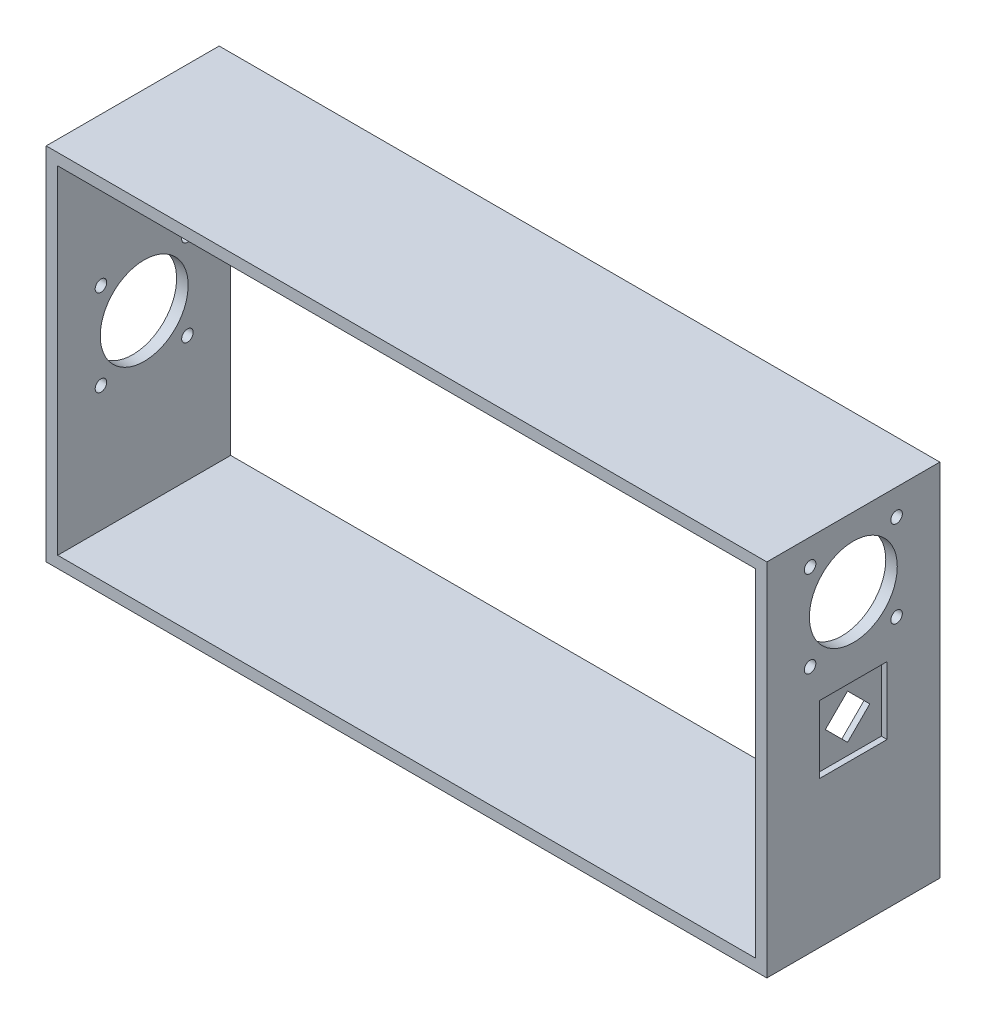
ISO-10303-21;
HEADER;
FILE_DESCRIPTION(('STEP AP214'),'2;1');
FILE_NAME('part.step','',(''),(''),'','','');
FILE_SCHEMA(('AUTOMOTIVE_DESIGN { 1 0 10303 214 1 1 1 1 }'));
ENDSEC;
DATA;
#1=APPLICATION_CONTEXT('core data for automotive mechanical design processes');
#2=APPLICATION_PROTOCOL_DEFINITION('international standard','automotive_design',2000,#1);
#3=PRODUCT_CONTEXT('',#1,'mechanical');
#4=PRODUCT('Part','Part','',(#3));
#5=PRODUCT_RELATED_PRODUCT_CATEGORY('part','',(#4));
#6=PRODUCT_DEFINITION_FORMATION('','',#4);
#7=PRODUCT_DEFINITION_CONTEXT('part definition',#1,'design');
#8=PRODUCT_DEFINITION('design','',#6,#7);
#9=PRODUCT_DEFINITION_SHAPE('','',#8);
#10=(LENGTH_UNIT() NAMED_UNIT(*) SI_UNIT(.MILLI.,.METRE.));
#11=(NAMED_UNIT(*) PLANE_ANGLE_UNIT() SI_UNIT($,.RADIAN.));
#12=(NAMED_UNIT(*) SI_UNIT($,.STERADIAN.) SOLID_ANGLE_UNIT());
#13=UNCERTAINTY_MEASURE_WITH_UNIT(LENGTH_MEASURE(1.E-05),#10,'distance_accuracy_value','');
#14=(GEOMETRIC_REPRESENTATION_CONTEXT(3) GLOBAL_UNCERTAINTY_ASSIGNED_CONTEXT((#13)) GLOBAL_UNIT_ASSIGNED_CONTEXT((#10,
#11,#12)) REPRESENTATION_CONTEXT('',''));
#15=CARTESIAN_POINT('',(0.,0.,0.));
#16=DIRECTION('',(0.,0.,1.));
#17=DIRECTION('',(1.,0.,0.));
#18=AXIS2_PLACEMENT_3D('',#15,#16,#17);
#19=CARTESIAN_POINT('',(228.,70.2074639149334,30.));
#20=DIRECTION('',(0.,0.707106781186548,-0.707106781186547));
#21=DIRECTION('',(0.,0.707106781186547,0.707106781186548));
#22=AXIS2_PLACEMENT_3D('',#19,#20,#21);
#23=PLANE('',#22);
#24=DIRECTION('',(0.,-0.707106781186547,-0.707106781186548));
#25=VECTOR('',#24,1.);
#26=CARTESIAN_POINT('',(248.,70.2074639149334,30.));
#27=LINE('',#26,#25);
#28=CARTESIAN_POINT('',(248.,70.2074639149334,30.));
#29=VERTEX_POINT('',#28);
#30=CARTESIAN_POINT('',(248.,62.5,22.2925360850666));
#31=VERTEX_POINT('',#30);
#32=EDGE_CURVE('E188',#29,#31,#27,.T.);
#33=ORIENTED_EDGE('',*,*,#32,.F.);
#34=DIRECTION('',(1.,0.,0.));
#35=VECTOR('',#34,1.);
#36=CARTESIAN_POINT('',(228.,70.2074639149334,30.));
#37=LINE('',#36,#35);
#38=CARTESIAN_POINT('',(246.,70.2074639149334,30.));
#39=VERTEX_POINT('',#38);
#40=EDGE_CURVE('E201',#39,#29,#37,.T.);
#41=ORIENTED_EDGE('',*,*,#40,.F.);
#42=DIRECTION('',(0.,-0.707106781186547,-0.707106781186548));
#43=VECTOR('',#42,1.);
#44=CARTESIAN_POINT('',(246.,110.603731957467,70.3962680425334));
#45=LINE('',#44,#43);
#46=CARTESIAN_POINT('',(246.,62.5,22.2925360850666));
#47=VERTEX_POINT('',#46);
#48=EDGE_CURVE('E43',#39,#47,#45,.T.);
#49=ORIENTED_EDGE('',*,*,#48,.T.);
#50=DIRECTION('',(1.,0.,0.));
#51=VECTOR('',#50,1.);
#52=CARTESIAN_POINT('',(228.,62.5,22.2925360850666));
#53=LINE('',#52,#51);
#54=EDGE_CURVE('E191',#47,#31,#53,.T.);
#55=ORIENTED_EDGE('',*,*,#54,.T.);
#56=EDGE_LOOP('',(#33,#41,#49,#55));
#57=FACE_BOUND('',#56,.T.);
#58=ADVANCED_FACE('F35',(#57),#23,.F.);
#59=CARTESIAN_POINT('',(228.,62.5,22.2925360850666));
#60=DIRECTION('',(0.,-0.707106781186548,-0.707106781186548));
#61=DIRECTION('',(0.,0.707106781186548,-0.707106781186548));
#62=AXIS2_PLACEMENT_3D('',#59,#60,#61);
#63=PLANE('',#62);
#64=DIRECTION('',(0.,-0.707106781186548,0.707106781186548));
#65=VECTOR('',#64,1.);
#66=CARTESIAN_POINT('',(248.,62.5,22.2925360850666));
#67=LINE('',#66,#65);
#68=CARTESIAN_POINT('',(248.,54.7925360850666,30.));
#69=VERTEX_POINT('',#68);
#70=EDGE_CURVE('E186',#31,#69,#67,.T.);
#71=ORIENTED_EDGE('',*,*,#70,.F.);
#72=ORIENTED_EDGE('',*,*,#54,.F.);
#73=DIRECTION('',(0.,-0.707106781186548,0.707106781186548));
#74=VECTOR('',#73,1.);
#75=CARTESIAN_POINT('',(246.,72.8962680425333,11.8962680425333));
#76=LINE('',#75,#74);
#77=CARTESIAN_POINT('',(246.,54.7925360850666,30.));
#78=VERTEX_POINT('',#77);
#79=EDGE_CURVE('E328',#47,#78,#76,.T.);
#80=ORIENTED_EDGE('',*,*,#79,.T.);
#81=DIRECTION('',(1.,0.,0.));
#82=VECTOR('',#81,1.);
#83=CARTESIAN_POINT('',(228.,54.7925360850666,30.));
#84=LINE('',#83,#82);
#85=EDGE_CURVE('E195',#78,#69,#84,.T.);
#86=ORIENTED_EDGE('',*,*,#85,.T.);
#87=EDGE_LOOP('',(#71,#72,#80,#86));
#88=FACE_BOUND('',#87,.T.);
#89=ADVANCED_FACE('F339',(#88),#63,.F.);
#90=CARTESIAN_POINT('',(228.,62.5,37.7074639149334));
#91=DIRECTION('',(0.,-0.707106781186547,0.707106781186548));
#92=DIRECTION('',(0.,-0.707106781186548,-0.707106781186547));
#93=AXIS2_PLACEMENT_3D('',#90,#91,#92);
#94=PLANE('',#93);
#95=DIRECTION('',(0.,0.707106781186548,0.707106781186547));
#96=VECTOR('',#95,1.);
#97=CARTESIAN_POINT('',(248.,62.5,37.7074639149334));
#98=LINE('',#97,#96);
#99=CARTESIAN_POINT('',(248.,62.5,37.7074639149334));
#100=VERTEX_POINT('',#99);
#101=EDGE_CURVE('E57',#69,#100,#98,.T.);
#102=ORIENTED_EDGE('',*,*,#101,.F.);
#103=ORIENTED_EDGE('',*,*,#85,.F.);
#104=DIRECTION('',(0.,0.707106781186548,0.707106781186547));
#105=VECTOR('',#104,1.);
#106=CARTESIAN_POINT('',(246.,102.896268042533,78.1037319574667));
#107=LINE('',#106,#105);
#108=CARTESIAN_POINT('',(246.,62.5,37.7074639149334));
#109=VERTEX_POINT('',#108);
#110=EDGE_CURVE('E325',#78,#109,#107,.T.);
#111=ORIENTED_EDGE('',*,*,#110,.T.);
#112=DIRECTION('',(1.,0.,0.));
#113=VECTOR('',#112,1.);
#114=CARTESIAN_POINT('',(228.,62.5,37.7074639149334));
#115=LINE('',#114,#113);
#116=EDGE_CURVE('E198',#109,#100,#115,.T.);
#117=ORIENTED_EDGE('',*,*,#116,.T.);
#118=EDGE_LOOP('',(#102,#103,#111,#117));
#119=FACE_BOUND('',#118,.T.);
#120=ADVANCED_FACE('F345',(#119),#94,.F.);
#121=CARTESIAN_POINT('',(228.,70.2074639149334,30.));
#122=DIRECTION('',(0.,0.707106781186547,0.707106781186548));
#123=DIRECTION('',(0.,-0.707106781186548,0.707106781186547));
#124=AXIS2_PLACEMENT_3D('',#121,#122,#123);
#125=PLANE('',#124);
#126=DIRECTION('',(0.,0.707106781186548,-0.707106781186547));
#127=VECTOR('',#126,1.);
#128=CARTESIAN_POINT('',(248.,70.2074639149334,30.));
#129=LINE('',#128,#127);
#130=EDGE_CURVE('E11',#100,#29,#129,.T.);
#131=ORIENTED_EDGE('',*,*,#130,.F.);
#132=ORIENTED_EDGE('',*,*,#116,.F.);
#133=DIRECTION('',(0.,0.707106781186548,-0.707106781186547));
#134=VECTOR('',#133,1.);
#135=CARTESIAN_POINT('',(246.,80.6037319574667,19.6037319574667));
#136=LINE('',#135,#134);
#137=EDGE_CURVE('E297',#109,#39,#136,.T.);
#138=ORIENTED_EDGE('',*,*,#137,.T.);
#139=ORIENTED_EDGE('',*,*,#40,.T.);
#140=EDGE_LOOP('',(#131,#132,#138,#139));
#141=FACE_BOUND('',#140,.T.);
#142=ADVANCED_FACE('F347',(#141),#125,.F.);
#143=CARTESIAN_POINT('',(0.,0.,60.));
#144=DIRECTION('',(0.,0.,1.));
#145=DIRECTION('',(1.,0.,0.));
#146=AXIS2_PLACEMENT_3D('',#143,#144,#145);
#147=PLANE('',#146);
#148=DIRECTION('',(0.,-1.,0.));
#149=VECTOR('',#148,1.);
#150=CARTESIAN_POINT('',(0.,125.,60.));
#151=LINE('',#150,#149);
#152=CARTESIAN_POINT('',(0.,125.,60.));
#153=VERTEX_POINT('',#152);
#154=CARTESIAN_POINT('',(0.,0.,60.));
#155=VERTEX_POINT('',#154);
#156=EDGE_CURVE('E268',#153,#155,#151,.T.);
#157=ORIENTED_EDGE('',*,*,#156,.T.);
#158=DIRECTION('',(1.,0.,0.));
#159=VECTOR('',#158,1.);
#160=CARTESIAN_POINT('',(0.,0.,60.));
#161=LINE('',#160,#159);
#162=CARTESIAN_POINT('',(250.,0.,60.));
#163=VERTEX_POINT('',#162);
#164=EDGE_CURVE('E271',#155,#163,#161,.T.);
#165=ORIENTED_EDGE('',*,*,#164,.T.);
#166=DIRECTION('',(0.,1.,0.));
#167=VECTOR('',#166,1.);
#168=CARTESIAN_POINT('',(250.,125.,60.));
#169=LINE('',#168,#167);
#170=CARTESIAN_POINT('',(250.,125.,60.));
#171=VERTEX_POINT('',#170);
#172=EDGE_CURVE('E274',#163,#171,#169,.T.);
#173=ORIENTED_EDGE('',*,*,#172,.T.);
#174=DIRECTION('',(-1.,0.,0.));
#175=VECTOR('',#174,1.);
#176=CARTESIAN_POINT('',(0.,125.,60.));
#177=LINE('',#176,#175);
#178=EDGE_CURVE('E276',#171,#153,#177,.T.);
#179=ORIENTED_EDGE('',*,*,#178,.T.);
#180=EDGE_LOOP('',(#157,#165,#173,#179));
#181=FACE_BOUND('',#180,.T.);
#182=DIRECTION('',(-1.,0.,0.));
#183=VECTOR('',#182,1.);
#184=CARTESIAN_POINT('',(246.,121.,60.));
#185=LINE('',#184,#183);
#186=CARTESIAN_POINT('',(246.,121.,60.));
#187=VERTEX_POINT('',#186);
#188=CARTESIAN_POINT('',(4.00000000000001,121.,60.));
#189=VERTEX_POINT('',#188);
#190=EDGE_CURVE('E237',#187,#189,#185,.T.);
#191=ORIENTED_EDGE('',*,*,#190,.F.);
#192=DIRECTION('',(0.,1.,0.));
#193=VECTOR('',#192,1.);
#194=CARTESIAN_POINT('',(246.,121.,60.));
#195=LINE('',#194,#193);
#196=CARTESIAN_POINT('',(246.,4.,60.));
#197=VERTEX_POINT('',#196);
#198=EDGE_CURVE('E235',#197,#187,#195,.T.);
#199=ORIENTED_EDGE('',*,*,#198,.F.);
#200=DIRECTION('',(1.,0.,0.));
#201=VECTOR('',#200,1.);
#202=CARTESIAN_POINT('',(246.,4.,60.));
#203=LINE('',#202,#201);
#204=CARTESIAN_POINT('',(4.00000000000003,3.99999999999998,60.));
#205=VERTEX_POINT('',#204);
#206=EDGE_CURVE('E243',#205,#197,#203,.T.);
#207=ORIENTED_EDGE('',*,*,#206,.F.);
#208=DIRECTION('',(0.,-1.,0.));
#209=VECTOR('',#208,1.);
#210=CARTESIAN_POINT('',(4.00000000000001,121.,60.));
#211=LINE('',#210,#209);
#212=EDGE_CURVE('E240',#189,#205,#211,.T.);
#213=ORIENTED_EDGE('',*,*,#212,.F.);
#214=EDGE_LOOP('',(#191,#199,#207,#213));
#215=FACE_BOUND('',#214,.T.);
#216=ADVANCED_FACE('F420',(#181,#215),#147,.T.);
#217=CARTESIAN_POINT('',(0.,0.,0.));
#218=DIRECTION('',(0.,0.,1.));
#219=DIRECTION('',(1.,0.,0.));
#220=AXIS2_PLACEMENT_3D('',#217,#218,#219);
#221=PLANE('',#220);
#222=DIRECTION('',(0.,-1.,0.));
#223=VECTOR('',#222,1.);
#224=CARTESIAN_POINT('',(0.,125.,0.));
#225=LINE('',#224,#223);
#226=CARTESIAN_POINT('',(0.,125.,0.));
#227=VERTEX_POINT('',#226);
#228=CARTESIAN_POINT('',(0.,0.,0.));
#229=VERTEX_POINT('',#228);
#230=EDGE_CURVE('E267',#227,#229,#225,.T.);
#231=ORIENTED_EDGE('',*,*,#230,.F.);
#232=DIRECTION('',(-1.,0.,0.));
#233=VECTOR('',#232,1.);
#234=CARTESIAN_POINT('',(0.,125.,0.));
#235=LINE('',#234,#233);
#236=CARTESIAN_POINT('',(250.,125.,0.));
#237=VERTEX_POINT('',#236);
#238=EDGE_CURVE('E272',#237,#227,#235,.T.);
#239=ORIENTED_EDGE('',*,*,#238,.F.);
#240=DIRECTION('',(0.,1.,0.));
#241=VECTOR('',#240,1.);
#242=CARTESIAN_POINT('',(250.,125.,0.));
#243=LINE('',#242,#241);
#244=CARTESIAN_POINT('',(250.,0.,0.));
#245=VERTEX_POINT('',#244);
#246=EDGE_CURVE('E283',#245,#237,#243,.T.);
#247=ORIENTED_EDGE('',*,*,#246,.F.);
#248=DIRECTION('',(1.,0.,0.));
#249=VECTOR('',#248,1.);
#250=CARTESIAN_POINT('',(0.,0.,0.));
#251=LINE('',#250,#249);
#252=EDGE_CURVE('E281',#229,#245,#251,.T.);
#253=ORIENTED_EDGE('',*,*,#252,.F.);
#254=EDGE_LOOP('',(#231,#239,#247,#253));
#255=FACE_BOUND('',#254,.T.);
#256=DIRECTION('',(0.,1.,0.));
#257=VECTOR('',#256,1.);
#258=CARTESIAN_POINT('',(246.,121.,0.));
#259=LINE('',#258,#257);
#260=CARTESIAN_POINT('',(246.,4.,0.));
#261=VERTEX_POINT('',#260);
#262=CARTESIAN_POINT('',(246.,121.,0.));
#263=VERTEX_POINT('',#262);
#264=EDGE_CURVE('E246',#261,#263,#259,.T.);
#265=ORIENTED_EDGE('',*,*,#264,.T.);
#266=DIRECTION('',(-1.,0.,0.));
#267=VECTOR('',#266,1.);
#268=CARTESIAN_POINT('',(246.,121.,0.));
#269=LINE('',#268,#267);
#270=CARTESIAN_POINT('',(4.00000000000001,121.,0.));
#271=VERTEX_POINT('',#270);
#272=EDGE_CURVE('E249',#263,#271,#269,.T.);
#273=ORIENTED_EDGE('',*,*,#272,.T.);
#274=DIRECTION('',(0.,-1.,0.));
#275=VECTOR('',#274,1.);
#276=CARTESIAN_POINT('',(4.00000000000001,121.,0.));
#277=LINE('',#276,#275);
#278=CARTESIAN_POINT('',(4.00000000000003,3.99999999999998,0.));
#279=VERTEX_POINT('',#278);
#280=EDGE_CURVE('E253',#271,#279,#277,.T.);
#281=ORIENTED_EDGE('',*,*,#280,.T.);
#282=DIRECTION('',(1.,0.,0.));
#283=VECTOR('',#282,1.);
#284=CARTESIAN_POINT('',(246.,4.,0.));
#285=LINE('',#284,#283);
#286=EDGE_CURVE('E238',#279,#261,#285,.T.);
#287=ORIENTED_EDGE('',*,*,#286,.T.);
#288=EDGE_LOOP('',(#265,#273,#281,#287));
#289=FACE_BOUND('',#288,.T.);
#290=ADVANCED_FACE('F423',(#255,#289),#221,.F.);
#291=CARTESIAN_POINT('',(0.,125.,60.));
#292=DIRECTION('',(1.,0.,0.));
#293=DIRECTION('',(0.,0.,-1.));
#294=AXIS2_PLACEMENT_3D('',#291,#292,#293);
#295=PLANE('',#294);
#296=CARTESIAN_POINT('',(0.,47.5,15.));
#297=DIRECTION('',(-1.,0.,0.));
#298=DIRECTION('',(0.,0.,1.));
#299=AXIS2_PLACEMENT_3D('',#296,#297,#298);
#300=CIRCLE('',#299,2.);
#301=CARTESIAN_POINT('',(0.,47.5,17.));
#302=VERTEX_POINT('',#301);
#303=EDGE_CURVE('E228',#302,#302,#300,.T.);
#304=ORIENTED_EDGE('',*,*,#303,.F.);
#305=EDGE_LOOP('',(#304));
#306=FACE_BOUND('',#305,.T.);
#307=CARTESIAN_POINT('',(0.,47.5,45.));
#308=DIRECTION('',(-1.,0.,0.));
#309=DIRECTION('',(0.,0.,1.));
#310=AXIS2_PLACEMENT_3D('',#307,#308,#309);
#311=CIRCLE('',#310,2.);
#312=CARTESIAN_POINT('',(0.,47.5,47.));
#313=VERTEX_POINT('',#312);
#314=EDGE_CURVE('E225',#313,#313,#311,.T.);
#315=ORIENTED_EDGE('',*,*,#314,.F.);
#316=EDGE_LOOP('',(#315));
#317=FACE_BOUND('',#316,.T.);
#318=CARTESIAN_POINT('',(0.,77.5,15.));
#319=DIRECTION('',(-1.,0.,0.));
#320=DIRECTION('',(0.,0.,1.));
#321=AXIS2_PLACEMENT_3D('',#318,#319,#320);
#322=CIRCLE('',#321,2.);
#323=CARTESIAN_POINT('',(0.,77.5,17.));
#324=VERTEX_POINT('',#323);
#325=EDGE_CURVE('E222',#324,#324,#322,.T.);
#326=ORIENTED_EDGE('',*,*,#325,.F.);
#327=EDGE_LOOP('',(#326));
#328=FACE_BOUND('',#327,.T.);
#329=CARTESIAN_POINT('',(0.,77.5,45.));
#330=DIRECTION('',(-1.,0.,0.));
#331=DIRECTION('',(0.,0.,1.));
#332=AXIS2_PLACEMENT_3D('',#329,#330,#331);
#333=CIRCLE('',#332,2.);
#334=CARTESIAN_POINT('',(0.,77.5,47.));
#335=VERTEX_POINT('',#334);
#336=EDGE_CURVE('E218',#335,#335,#333,.T.);
#337=ORIENTED_EDGE('',*,*,#336,.F.);
#338=EDGE_LOOP('',(#337));
#339=FACE_BOUND('',#338,.T.);
#340=CARTESIAN_POINT('',(0.,62.5,30.));
#341=DIRECTION('',(-1.,0.,0.));
#342=DIRECTION('',(0.,0.,1.));
#343=AXIS2_PLACEMENT_3D('',#340,#341,#342);
#344=CIRCLE('',#343,15.25);
#345=CARTESIAN_POINT('',(0.,62.5,45.25));
#346=VERTEX_POINT('',#345);
#347=EDGE_CURVE('E221',#346,#346,#344,.T.);
#348=ORIENTED_EDGE('',*,*,#347,.F.);
#349=EDGE_LOOP('',(#348));
#350=FACE_BOUND('',#349,.T.);
#351=ORIENTED_EDGE('',*,*,#230,.T.);
#352=DIRECTION('',(0.,0.,-1.));
#353=VECTOR('',#352,1.);
#354=CARTESIAN_POINT('',(0.,0.,60.));
#355=LINE('',#354,#353);
#356=EDGE_CURVE('E294',#155,#229,#355,.T.);
#357=ORIENTED_EDGE('',*,*,#356,.F.);
#358=ORIENTED_EDGE('',*,*,#156,.F.);
#359=DIRECTION('',(0.,0.,-1.));
#360=VECTOR('',#359,1.);
#361=CARTESIAN_POINT('',(0.,125.,60.));
#362=LINE('',#361,#360);
#363=EDGE_CURVE('E278',#153,#227,#362,.T.);
#364=ORIENTED_EDGE('',*,*,#363,.T.);
#365=EDGE_LOOP('',(#351,#357,#358,#364));
#366=FACE_BOUND('',#365,.T.);
#367=ADVANCED_FACE('F37',(#306,#317,#328,#339,#350,#366),#295,.F.);
#368=CARTESIAN_POINT('',(0.,0.,60.));
#369=DIRECTION('',(0.,1.,0.));
#370=DIRECTION('',(0.,0.,1.));
#371=AXIS2_PLACEMENT_3D('',#368,#369,#370);
#372=PLANE('',#371);
#373=ORIENTED_EDGE('',*,*,#252,.T.);
#374=DIRECTION('',(0.,0.,-1.));
#375=VECTOR('',#374,1.);
#376=CARTESIAN_POINT('',(250.,0.,60.));
#377=LINE('',#376,#375);
#378=EDGE_CURVE('E291',#163,#245,#377,.T.);
#379=ORIENTED_EDGE('',*,*,#378,.F.);
#380=ORIENTED_EDGE('',*,*,#164,.F.);
#381=ORIENTED_EDGE('',*,*,#356,.T.);
#382=EDGE_LOOP('',(#373,#379,#380,#381));
#383=FACE_BOUND('',#382,.T.);
#384=ADVANCED_FACE('F433',(#383),#372,.F.);
#385=CARTESIAN_POINT('',(250.,125.,60.));
#386=DIRECTION('',(-1.,0.,0.));
#387=DIRECTION('',(0.,0.,1.));
#388=AXIS2_PLACEMENT_3D('',#385,#386,#387);
#389=PLANE('',#388);
#390=DIRECTION('',(0.,0.,-1.));
#391=VECTOR('',#390,1.);
#392=CARTESIAN_POINT('',(250.,50.7925360850666,41.7074639149334));
#393=LINE('',#392,#391);
#394=CARTESIAN_POINT('',(250.,50.7925360850666,41.7074639149334));
#395=VERTEX_POINT('',#394);
#396=CARTESIAN_POINT('',(250.,50.7925360850666,18.2925360850666));
#397=VERTEX_POINT('',#396);
#398=EDGE_CURVE('E176',#395,#397,#393,.T.);
#399=ORIENTED_EDGE('',*,*,#398,.F.);
#400=DIRECTION('',(0.,-1.,0.));
#401=VECTOR('',#400,1.);
#402=CARTESIAN_POINT('',(250.,74.2074639149334,41.7074639149334));
#403=LINE('',#402,#401);
#404=CARTESIAN_POINT('',(250.,74.2074639149334,41.7074639149334));
#405=VERTEX_POINT('',#404);
#406=EDGE_CURVE('E50',#405,#395,#403,.T.);
#407=ORIENTED_EDGE('',*,*,#406,.F.);
#408=DIRECTION('',(0.,0.,1.));
#409=VECTOR('',#408,1.);
#410=CARTESIAN_POINT('',(250.,74.2074639149334,41.7074639149334));
#411=LINE('',#410,#409);
#412=CARTESIAN_POINT('',(250.,74.2074639149334,18.2925360850666));
#413=VERTEX_POINT('',#412);
#414=EDGE_CURVE('E167',#413,#405,#411,.T.);
#415=ORIENTED_EDGE('',*,*,#414,.F.);
#416=DIRECTION('',(0.,1.,0.));
#417=VECTOR('',#416,1.);
#418=CARTESIAN_POINT('',(250.,74.2074639149334,18.2925360850666));
#419=LINE('',#418,#417);
#420=EDGE_CURVE('E170',#397,#413,#419,.T.);
#421=ORIENTED_EDGE('',*,*,#420,.F.);
#422=EDGE_LOOP('',(#399,#407,#415,#421));
#423=FACE_BOUND('',#422,.T.);
#424=CARTESIAN_POINT('',(250.,116.,15.));
#425=DIRECTION('',(1.,0.,0.));
#426=DIRECTION('',(0.,0.,-1.));
#427=AXIS2_PLACEMENT_3D('',#424,#425,#426);
#428=CIRCLE('',#427,2.);
#429=CARTESIAN_POINT('',(250.,116.,13.));
#430=VERTEX_POINT('',#429);
#431=EDGE_CURVE('E190',#430,#430,#428,.T.);
#432=ORIENTED_EDGE('',*,*,#431,.F.);
#433=EDGE_LOOP('',(#432));
#434=FACE_BOUND('',#433,.T.);
#435=CARTESIAN_POINT('',(250.,116.,45.));
#436=DIRECTION('',(1.,0.,0.));
#437=DIRECTION('',(0.,0.,-1.));
#438=AXIS2_PLACEMENT_3D('',#435,#436,#437);
#439=CIRCLE('',#438,2.);
#440=CARTESIAN_POINT('',(250.,116.,43.));
#441=VERTEX_POINT('',#440);
#442=EDGE_CURVE('E211',#441,#441,#439,.T.);
#443=ORIENTED_EDGE('',*,*,#442,.F.);
#444=EDGE_LOOP('',(#443));
#445=FACE_BOUND('',#444,.T.);
#446=CARTESIAN_POINT('',(250.,101.,30.));
#447=DIRECTION('',(1.,0.,0.));
#448=DIRECTION('',(0.,0.,-1.));
#449=AXIS2_PLACEMENT_3D('',#446,#447,#448);
#450=CIRCLE('',#449,15.25);
#451=CARTESIAN_POINT('',(250.,101.,14.75));
#452=VERTEX_POINT('',#451);
#453=EDGE_CURVE('E204',#452,#452,#450,.T.);
#454=ORIENTED_EDGE('',*,*,#453,.F.);
#455=EDGE_LOOP('',(#454));
#456=FACE_BOUND('',#455,.T.);
#457=CARTESIAN_POINT('',(250.,86.,15.));
#458=DIRECTION('',(1.,0.,0.));
#459=DIRECTION('',(0.,0.,-1.));
#460=AXIS2_PLACEMENT_3D('',#457,#458,#459);
#461=CIRCLE('',#460,2.);
#462=CARTESIAN_POINT('',(250.,86.,13.));
#463=VERTEX_POINT('',#462);
#464=EDGE_CURVE('E208',#463,#463,#461,.T.);
#465=ORIENTED_EDGE('',*,*,#464,.F.);
#466=EDGE_LOOP('',(#465));
#467=FACE_BOUND('',#466,.T.);
#468=CARTESIAN_POINT('',(250.,86.,45.));
#469=DIRECTION('',(1.,0.,0.));
#470=DIRECTION('',(0.,0.,-1.));
#471=AXIS2_PLACEMENT_3D('',#468,#469,#470);
#472=CIRCLE('',#471,2.);
#473=CARTESIAN_POINT('',(250.,86.,43.));
#474=VERTEX_POINT('',#473);
#475=EDGE_CURVE('E207',#474,#474,#472,.T.);
#476=ORIENTED_EDGE('',*,*,#475,.F.);
#477=EDGE_LOOP('',(#476));
#478=FACE_BOUND('',#477,.T.);
#479=ORIENTED_EDGE('',*,*,#246,.T.);
#480=DIRECTION('',(0.,0.,-1.));
#481=VECTOR('',#480,1.);
#482=CARTESIAN_POINT('',(250.,125.,60.));
#483=LINE('',#482,#481);
#484=EDGE_CURVE('E288',#171,#237,#483,.T.);
#485=ORIENTED_EDGE('',*,*,#484,.F.);
#486=ORIENTED_EDGE('',*,*,#172,.F.);
#487=ORIENTED_EDGE('',*,*,#378,.T.);
#488=EDGE_LOOP('',(#479,#485,#486,#487));
#489=FACE_BOUND('',#488,.T.);
#490=ADVANCED_FACE('F430',(#423,#434,#445,#456,#467,#478,#489),#389,.F.);
#491=CARTESIAN_POINT('',(0.,125.,60.));
#492=DIRECTION('',(0.,-1.,0.));
#493=DIRECTION('',(1.,0.,0.));
#494=AXIS2_PLACEMENT_3D('',#491,#492,#493);
#495=PLANE('',#494);
#496=ORIENTED_EDGE('',*,*,#238,.T.);
#497=ORIENTED_EDGE('',*,*,#363,.F.);
#498=ORIENTED_EDGE('',*,*,#178,.F.);
#499=ORIENTED_EDGE('',*,*,#484,.T.);
#500=EDGE_LOOP('',(#496,#497,#498,#499));
#501=FACE_BOUND('',#500,.T.);
#502=ADVANCED_FACE('F419',(#501),#495,.F.);
#503=CARTESIAN_POINT('',(246.,121.,60.));
#504=DIRECTION('',(-1.,0.,0.));
#505=DIRECTION('',(0.,-1.,0.));
#506=AXIS2_PLACEMENT_3D('',#503,#504,#505);
#507=PLANE('',#506);
#508=ORIENTED_EDGE('',*,*,#48,.F.);
#509=ORIENTED_EDGE('',*,*,#137,.F.);
#510=ORIENTED_EDGE('',*,*,#110,.F.);
#511=ORIENTED_EDGE('',*,*,#79,.F.);
#512=EDGE_LOOP('',(#508,#509,#510,#511));
#513=FACE_BOUND('',#512,.T.);
#514=CARTESIAN_POINT('',(246.,116.,15.));
#515=DIRECTION('',(-1.,0.,0.));
#516=DIRECTION('',(0.,-1.,0.));
#517=AXIS2_PLACEMENT_3D('',#514,#515,#516);
#518=CIRCLE('',#517,2.);
#519=CARTESIAN_POINT('',(246.,114.,15.));
#520=VERTEX_POINT('',#519);
#521=EDGE_CURVE('E231',#520,#520,#518,.T.);
#522=ORIENTED_EDGE('',*,*,#521,.F.);
#523=EDGE_LOOP('',(#522));
#524=FACE_BOUND('',#523,.T.);
#525=CARTESIAN_POINT('',(246.,116.,45.));
#526=DIRECTION('',(-1.,0.,0.));
#527=DIRECTION('',(0.,-1.,0.));
#528=AXIS2_PLACEMENT_3D('',#525,#526,#527);
#529=CIRCLE('',#528,2.);
#530=CARTESIAN_POINT('',(246.,114.,45.));
#531=VERTEX_POINT('',#530);
#532=EDGE_CURVE('E319',#531,#531,#529,.T.);
#533=ORIENTED_EDGE('',*,*,#532,.F.);
#534=EDGE_LOOP('',(#533));
#535=FACE_BOUND('',#534,.T.);
#536=CARTESIAN_POINT('',(246.,101.,30.));
#537=DIRECTION('',(-1.,0.,0.));
#538=DIRECTION('',(0.,-1.,0.));
#539=AXIS2_PLACEMENT_3D('',#536,#537,#538);
#540=CIRCLE('',#539,15.25);
#541=CARTESIAN_POINT('',(246.,85.75,30.));
#542=VERTEX_POINT('',#541);
#543=EDGE_CURVE('E316',#542,#542,#540,.T.);
#544=ORIENTED_EDGE('',*,*,#543,.F.);
#545=EDGE_LOOP('',(#544));
#546=FACE_BOUND('',#545,.T.);
#547=CARTESIAN_POINT('',(246.,86.,15.));
#548=DIRECTION('',(-1.,0.,0.));
#549=DIRECTION('',(0.,-1.,0.));
#550=AXIS2_PLACEMENT_3D('',#547,#548,#549);
#551=CIRCLE('',#550,2.);
#552=CARTESIAN_POINT('',(246.,84.,15.));
#553=VERTEX_POINT('',#552);
#554=EDGE_CURVE('E313',#553,#553,#551,.T.);
#555=ORIENTED_EDGE('',*,*,#554,.F.);
#556=EDGE_LOOP('',(#555));
#557=FACE_BOUND('',#556,.T.);
#558=CARTESIAN_POINT('',(246.,86.,45.));
#559=DIRECTION('',(-1.,0.,0.));
#560=DIRECTION('',(0.,-1.,0.));
#561=AXIS2_PLACEMENT_3D('',#558,#559,#560);
#562=CIRCLE('',#561,2.);
#563=CARTESIAN_POINT('',(246.,84.,45.));
#564=VERTEX_POINT('',#563);
#565=EDGE_CURVE('E194',#564,#564,#562,.T.);
#566=ORIENTED_EDGE('',*,*,#565,.F.);
#567=EDGE_LOOP('',(#566));
#568=FACE_BOUND('',#567,.T.);
#569=ORIENTED_EDGE('',*,*,#264,.F.);
#570=DIRECTION('',(0.,0.,-1.));
#571=VECTOR('',#570,1.);
#572=CARTESIAN_POINT('',(246.,4.,60.));
#573=LINE('',#572,#571);
#574=EDGE_CURVE('E245',#197,#261,#573,.T.);
#575=ORIENTED_EDGE('',*,*,#574,.F.);
#576=ORIENTED_EDGE('',*,*,#198,.T.);
#577=DIRECTION('',(0.,0.,-1.));
#578=VECTOR('',#577,1.);
#579=CARTESIAN_POINT('',(246.,121.,60.));
#580=LINE('',#579,#578);
#581=EDGE_CURVE('E264',#187,#263,#580,.T.);
#582=ORIENTED_EDGE('',*,*,#581,.T.);
#583=EDGE_LOOP('',(#569,#575,#576,#582));
#584=FACE_BOUND('',#583,.T.);
#585=ADVANCED_FACE('F342',(#513,#524,#535,#546,#557,#568,#584),#507,.T.);
#586=CARTESIAN_POINT('',(246.,121.,60.));
#587=DIRECTION('',(0.,-1.,0.));
#588=DIRECTION('',(1.,0.,0.));
#589=AXIS2_PLACEMENT_3D('',#586,#587,#588);
#590=PLANE('',#589);
#591=ORIENTED_EDGE('',*,*,#272,.F.);
#592=ORIENTED_EDGE('',*,*,#581,.F.);
#593=ORIENTED_EDGE('',*,*,#190,.T.);
#594=DIRECTION('',(0.,0.,-1.));
#595=VECTOR('',#594,1.);
#596=CARTESIAN_POINT('',(4.00000000000001,121.,60.));
#597=LINE('',#596,#595);
#598=EDGE_CURVE('E262',#189,#271,#597,.T.);
#599=ORIENTED_EDGE('',*,*,#598,.T.);
#600=EDGE_LOOP('',(#591,#592,#593,#599));
#601=FACE_BOUND('',#600,.T.);
#602=ADVANCED_FACE('F412',(#601),#590,.T.);
#603=CARTESIAN_POINT('',(4.00000000000001,121.,60.));
#604=DIRECTION('',(1.,0.,0.));
#605=DIRECTION('',(0.,1.,0.));
#606=AXIS2_PLACEMENT_3D('',#603,#604,#605);
#607=PLANE('',#606);
#608=CARTESIAN_POINT('',(4.00000000000002,47.5,15.));
#609=DIRECTION('',(1.,0.,0.));
#610=DIRECTION('',(0.,1.,0.));
#611=AXIS2_PLACEMENT_3D('',#608,#609,#610);
#612=CIRCLE('',#611,2.);
#613=CARTESIAN_POINT('',(4.00000000000002,49.5,15.));
#614=VERTEX_POINT('',#613);
#615=EDGE_CURVE('E250',#614,#614,#612,.T.);
#616=ORIENTED_EDGE('',*,*,#615,.F.);
#617=EDGE_LOOP('',(#616));
#618=FACE_BOUND('',#617,.T.);
#619=CARTESIAN_POINT('',(4.00000000000002,47.5,45.));
#620=DIRECTION('',(1.,0.,0.));
#621=DIRECTION('',(0.,1.,0.));
#622=AXIS2_PLACEMENT_3D('',#619,#620,#621);
#623=CIRCLE('',#622,2.);
#624=CARTESIAN_POINT('',(4.00000000000002,49.5,45.));
#625=VERTEX_POINT('',#624);
#626=EDGE_CURVE('E306',#625,#625,#623,.T.);
#627=ORIENTED_EDGE('',*,*,#626,.F.);
#628=EDGE_LOOP('',(#627));
#629=FACE_BOUND('',#628,.T.);
#630=CARTESIAN_POINT('',(4.00000000000002,77.5,15.));
#631=DIRECTION('',(1.,0.,0.));
#632=DIRECTION('',(0.,1.,0.));
#633=AXIS2_PLACEMENT_3D('',#630,#631,#632);
#634=CIRCLE('',#633,2.);
#635=CARTESIAN_POINT('',(4.00000000000002,79.5,15.));
#636=VERTEX_POINT('',#635);
#637=EDGE_CURVE('E303',#636,#636,#634,.T.);
#638=ORIENTED_EDGE('',*,*,#637,.F.);
#639=EDGE_LOOP('',(#638));
#640=FACE_BOUND('',#639,.T.);
#641=CARTESIAN_POINT('',(4.00000000000002,77.5,45.));
#642=DIRECTION('',(1.,0.,0.));
#643=DIRECTION('',(0.,1.,0.));
#644=AXIS2_PLACEMENT_3D('',#641,#642,#643);
#645=CIRCLE('',#644,2.);
#646=CARTESIAN_POINT('',(4.00000000000002,79.5,45.));
#647=VERTEX_POINT('',#646);
#648=EDGE_CURVE('E300',#647,#647,#645,.T.);
#649=ORIENTED_EDGE('',*,*,#648,.F.);
#650=EDGE_LOOP('',(#649));
#651=FACE_BOUND('',#650,.T.);
#652=CARTESIAN_POINT('',(4.00000000000002,62.5,30.));
#653=DIRECTION('',(1.,0.,0.));
#654=DIRECTION('',(0.,1.,0.));
#655=AXIS2_PLACEMENT_3D('',#652,#653,#654);
#656=CIRCLE('',#655,15.25);
#657=CARTESIAN_POINT('',(4.00000000000002,77.75,30.));
#658=VERTEX_POINT('',#657);
#659=EDGE_CURVE('E234',#658,#658,#656,.T.);
#660=ORIENTED_EDGE('',*,*,#659,.F.);
#661=EDGE_LOOP('',(#660));
#662=FACE_BOUND('',#661,.T.);
#663=ORIENTED_EDGE('',*,*,#280,.F.);
#664=ORIENTED_EDGE('',*,*,#598,.F.);
#665=ORIENTED_EDGE('',*,*,#212,.T.);
#666=DIRECTION('',(0.,0.,-1.));
#667=VECTOR('',#666,1.);
#668=CARTESIAN_POINT('',(4.00000000000003,3.99999999999998,60.));
#669=LINE('',#668,#667);
#670=EDGE_CURVE('E260',#205,#279,#669,.T.);
#671=ORIENTED_EDGE('',*,*,#670,.T.);
#672=EDGE_LOOP('',(#663,#664,#665,#671));
#673=FACE_BOUND('',#672,.T.);
#674=ADVANCED_FACE('F408',(#618,#629,#640,#651,#662,#673),#607,.T.);
#675=CARTESIAN_POINT('',(246.,4.,60.));
#676=DIRECTION('',(0.,1.,0.));
#677=DIRECTION('',(-1.,0.,0.));
#678=AXIS2_PLACEMENT_3D('',#675,#676,#677);
#679=PLANE('',#678);
#680=ORIENTED_EDGE('',*,*,#286,.F.);
#681=ORIENTED_EDGE('',*,*,#670,.F.);
#682=ORIENTED_EDGE('',*,*,#206,.T.);
#683=ORIENTED_EDGE('',*,*,#574,.T.);
#684=EDGE_LOOP('',(#680,#681,#682,#683));
#685=FACE_BOUND('',#684,.T.);
#686=ADVANCED_FACE('F404',(#685),#679,.T.);
#687=CARTESIAN_POINT('',(10.,62.5,30.));
#688=DIRECTION('',(-1.,0.,0.));
#689=DIRECTION('',(0.,0.,1.));
#690=AXIS2_PLACEMENT_3D('',#687,#688,#689);
#691=CYLINDRICAL_SURFACE('',#690,15.25);
#692=ORIENTED_EDGE('',*,*,#659,.T.);
#693=EDGE_LOOP('',(#692));
#694=FACE_BOUND('',#693,.T.);
#695=ORIENTED_EDGE('',*,*,#347,.T.);
#696=EDGE_LOOP('',(#695));
#697=FACE_BOUND('',#696,.T.);
#698=ADVANCED_FACE('F390',(#694,#697),#691,.F.);
#699=CARTESIAN_POINT('',(10.,77.5,45.));
#700=DIRECTION('',(-1.,0.,0.));
#701=DIRECTION('',(0.,0.,1.));
#702=AXIS2_PLACEMENT_3D('',#699,#700,#701);
#703=CYLINDRICAL_SURFACE('',#702,2.);
#704=ORIENTED_EDGE('',*,*,#648,.T.);
#705=EDGE_LOOP('',(#704));
#706=FACE_BOUND('',#705,.T.);
#707=ORIENTED_EDGE('',*,*,#336,.T.);
#708=EDGE_LOOP('',(#707));
#709=FACE_BOUND('',#708,.T.);
#710=ADVANCED_FACE('F386',(#706,#709),#703,.F.);
#711=CARTESIAN_POINT('',(10.,77.5,15.));
#712=DIRECTION('',(-1.,0.,0.));
#713=DIRECTION('',(0.,0.,1.));
#714=AXIS2_PLACEMENT_3D('',#711,#712,#713);
#715=CYLINDRICAL_SURFACE('',#714,2.);
#716=ORIENTED_EDGE('',*,*,#637,.T.);
#717=EDGE_LOOP('',(#716));
#718=FACE_BOUND('',#717,.T.);
#719=ORIENTED_EDGE('',*,*,#325,.T.);
#720=EDGE_LOOP('',(#719));
#721=FACE_BOUND('',#720,.T.);
#722=ADVANCED_FACE('F389',(#718,#721),#715,.F.);
#723=CARTESIAN_POINT('',(10.,47.5,45.));
#724=DIRECTION('',(-1.,0.,0.));
#725=DIRECTION('',(0.,0.,1.));
#726=AXIS2_PLACEMENT_3D('',#723,#724,#725);
#727=CYLINDRICAL_SURFACE('',#726,2.);
#728=ORIENTED_EDGE('',*,*,#626,.T.);
#729=EDGE_LOOP('',(#728));
#730=FACE_BOUND('',#729,.T.);
#731=ORIENTED_EDGE('',*,*,#314,.T.);
#732=EDGE_LOOP('',(#731));
#733=FACE_BOUND('',#732,.T.);
#734=ADVANCED_FACE('F394',(#730,#733),#727,.F.);
#735=CARTESIAN_POINT('',(10.,47.5,15.));
#736=DIRECTION('',(-1.,0.,0.));
#737=DIRECTION('',(0.,0.,1.));
#738=AXIS2_PLACEMENT_3D('',#735,#736,#737);
#739=CYLINDRICAL_SURFACE('',#738,2.);
#740=ORIENTED_EDGE('',*,*,#615,.T.);
#741=EDGE_LOOP('',(#740));
#742=FACE_BOUND('',#741,.T.);
#743=ORIENTED_EDGE('',*,*,#303,.T.);
#744=EDGE_LOOP('',(#743));
#745=FACE_BOUND('',#744,.T.);
#746=ADVANCED_FACE('F378',(#742,#745),#739,.F.);
#747=CARTESIAN_POINT('',(228.,86.,45.));
#748=DIRECTION('',(1.,0.,0.));
#749=DIRECTION('',(0.,0.,-1.));
#750=AXIS2_PLACEMENT_3D('',#747,#748,#749);
#751=CYLINDRICAL_SURFACE('',#750,2.);
#752=ORIENTED_EDGE('',*,*,#565,.T.);
#753=EDGE_LOOP('',(#752));
#754=FACE_BOUND('',#753,.T.);
#755=ORIENTED_EDGE('',*,*,#475,.T.);
#756=EDGE_LOOP('',(#755));
#757=FACE_BOUND('',#756,.T.);
#758=ADVANCED_FACE('F374',(#754,#757),#751,.F.);
#759=CARTESIAN_POINT('',(228.,86.,15.));
#760=DIRECTION('',(1.,0.,0.));
#761=DIRECTION('',(0.,0.,-1.));
#762=AXIS2_PLACEMENT_3D('',#759,#760,#761);
#763=CYLINDRICAL_SURFACE('',#762,2.);
#764=ORIENTED_EDGE('',*,*,#554,.T.);
#765=EDGE_LOOP('',(#764));
#766=FACE_BOUND('',#765,.T.);
#767=ORIENTED_EDGE('',*,*,#464,.T.);
#768=EDGE_LOOP('',(#767));
#769=FACE_BOUND('',#768,.T.);
#770=ADVANCED_FACE('F370',(#766,#769),#763,.F.);
#771=CARTESIAN_POINT('',(228.,101.,30.));
#772=DIRECTION('',(1.,0.,0.));
#773=DIRECTION('',(0.,0.,-1.));
#774=AXIS2_PLACEMENT_3D('',#771,#772,#773);
#775=CYLINDRICAL_SURFACE('',#774,15.25);
#776=ORIENTED_EDGE('',*,*,#543,.T.);
#777=EDGE_LOOP('',(#776));
#778=FACE_BOUND('',#777,.T.);
#779=ORIENTED_EDGE('',*,*,#453,.T.);
#780=EDGE_LOOP('',(#779));
#781=FACE_BOUND('',#780,.T.);
#782=ADVANCED_FACE('F373',(#778,#781),#775,.F.);
#783=CARTESIAN_POINT('',(228.,116.,45.));
#784=DIRECTION('',(1.,0.,0.));
#785=DIRECTION('',(0.,0.,-1.));
#786=AXIS2_PLACEMENT_3D('',#783,#784,#785);
#787=CYLINDRICAL_SURFACE('',#786,2.);
#788=ORIENTED_EDGE('',*,*,#532,.T.);
#789=EDGE_LOOP('',(#788));
#790=FACE_BOUND('',#789,.T.);
#791=ORIENTED_EDGE('',*,*,#442,.T.);
#792=EDGE_LOOP('',(#791));
#793=FACE_BOUND('',#792,.T.);
#794=ADVANCED_FACE('F357',(#790,#793),#787,.F.);
#795=CARTESIAN_POINT('',(228.,116.,15.));
#796=DIRECTION('',(1.,0.,0.));
#797=DIRECTION('',(0.,0.,-1.));
#798=AXIS2_PLACEMENT_3D('',#795,#796,#797);
#799=CYLINDRICAL_SURFACE('',#798,2.);
#800=ORIENTED_EDGE('',*,*,#521,.T.);
#801=EDGE_LOOP('',(#800));
#802=FACE_BOUND('',#801,.T.);
#803=ORIENTED_EDGE('',*,*,#431,.T.);
#804=EDGE_LOOP('',(#803));
#805=FACE_BOUND('',#804,.T.);
#806=ADVANCED_FACE('F349',(#802,#805),#799,.F.);
#807=CARTESIAN_POINT('',(248.,0.,0.));
#808=DIRECTION('',(1.,0.,0.));
#809=DIRECTION('',(0.,0.,-1.));
#810=AXIS2_PLACEMENT_3D('',#807,#808,#809);
#811=PLANE('',#810);
#812=DIRECTION('',(0.,-1.,0.));
#813=VECTOR('',#812,1.);
#814=CARTESIAN_POINT('',(248.,74.2074639149334,41.7074639149334));
#815=LINE('',#814,#813);
#816=CARTESIAN_POINT('',(248.,74.2074639149334,41.7074639149334));
#817=VERTEX_POINT('',#816);
#818=CARTESIAN_POINT('',(248.,50.7925360850666,41.7074639149334));
#819=VERTEX_POINT('',#818);
#820=EDGE_CURVE('E149',#817,#819,#815,.T.);
#821=ORIENTED_EDGE('',*,*,#820,.T.);
#822=DIRECTION('',(0.,0.,-1.));
#823=VECTOR('',#822,1.);
#824=CARTESIAN_POINT('',(248.,50.7925360850666,41.7074639149334));
#825=LINE('',#824,#823);
#826=CARTESIAN_POINT('',(248.,50.7925360850666,18.2925360850666));
#827=VERTEX_POINT('',#826);
#828=EDGE_CURVE('E158',#819,#827,#825,.T.);
#829=ORIENTED_EDGE('',*,*,#828,.T.);
#830=DIRECTION('',(0.,1.,0.));
#831=VECTOR('',#830,1.);
#832=CARTESIAN_POINT('',(248.,74.2074639149334,18.2925360850666));
#833=LINE('',#832,#831);
#834=CARTESIAN_POINT('',(248.,74.2074639149334,18.2925360850666));
#835=VERTEX_POINT('',#834);
#836=EDGE_CURVE('E163',#827,#835,#833,.T.);
#837=ORIENTED_EDGE('',*,*,#836,.T.);
#838=DIRECTION('',(0.,0.,1.));
#839=VECTOR('',#838,1.);
#840=CARTESIAN_POINT('',(248.,74.2074639149334,41.7074639149334));
#841=LINE('',#840,#839);
#842=EDGE_CURVE('E155',#835,#817,#841,.T.);
#843=ORIENTED_EDGE('',*,*,#842,.T.);
#844=EDGE_LOOP('',(#821,#829,#837,#843));
#845=FACE_BOUND('',#844,.T.);
#846=ORIENTED_EDGE('',*,*,#32,.T.);
#847=ORIENTED_EDGE('',*,*,#70,.T.);
#848=ORIENTED_EDGE('',*,*,#101,.T.);
#849=ORIENTED_EDGE('',*,*,#130,.T.);
#850=EDGE_LOOP('',(#846,#847,#848,#849));
#851=FACE_BOUND('',#850,.T.);
#852=ADVANCED_FACE('F165',(#845,#851),#811,.T.);
#853=CARTESIAN_POINT('',(248.,74.2074639149334,41.7074639149334));
#854=DIRECTION('',(0.,0.,1.));
#855=DIRECTION('',(1.,0.,0.));
#856=AXIS2_PLACEMENT_3D('',#853,#854,#855);
#857=PLANE('',#856);
#858=ORIENTED_EDGE('',*,*,#406,.T.);
#859=DIRECTION('',(1.,0.,0.));
#860=VECTOR('',#859,1.);
#861=CARTESIAN_POINT('',(248.,50.7925360850666,41.7074639149334));
#862=LINE('',#861,#860);
#863=EDGE_CURVE('E145',#819,#395,#862,.T.);
#864=ORIENTED_EDGE('',*,*,#863,.F.);
#865=ORIENTED_EDGE('',*,*,#820,.F.);
#866=DIRECTION('',(1.,0.,0.));
#867=VECTOR('',#866,1.);
#868=CARTESIAN_POINT('',(248.,74.2074639149334,41.7074639149334));
#869=LINE('',#868,#867);
#870=EDGE_CURVE('E180',#817,#405,#869,.T.);
#871=ORIENTED_EDGE('',*,*,#870,.T.);
#872=EDGE_LOOP('',(#858,#864,#865,#871));
#873=FACE_BOUND('',#872,.T.);
#874=ADVANCED_FACE('F147',(#873),#857,.F.);
#875=CARTESIAN_POINT('',(248.,74.2074639149334,41.7074639149334));
#876=DIRECTION('',(0.,1.,0.));
#877=DIRECTION('',(0.,0.,1.));
#878=AXIS2_PLACEMENT_3D('',#875,#876,#877);
#879=PLANE('',#878);
#880=ORIENTED_EDGE('',*,*,#414,.T.);
#881=ORIENTED_EDGE('',*,*,#870,.F.);
#882=ORIENTED_EDGE('',*,*,#842,.F.);
#883=DIRECTION('',(1.,0.,0.));
#884=VECTOR('',#883,1.);
#885=CARTESIAN_POINT('',(248.,74.2074639149334,18.2925360850666));
#886=LINE('',#885,#884);
#887=EDGE_CURVE('E182',#835,#413,#886,.T.);
#888=ORIENTED_EDGE('',*,*,#887,.T.);
#889=EDGE_LOOP('',(#880,#881,#882,#888));
#890=FACE_BOUND('',#889,.T.);
#891=ADVANCED_FACE('F355',(#890),#879,.F.);
#892=CARTESIAN_POINT('',(248.,74.2074639149334,18.2925360850666));
#893=DIRECTION('',(0.,0.,-1.));
#894=DIRECTION('',(0.,1.,0.));
#895=AXIS2_PLACEMENT_3D('',#892,#893,#894);
#896=PLANE('',#895);
#897=ORIENTED_EDGE('',*,*,#420,.T.);
#898=ORIENTED_EDGE('',*,*,#887,.F.);
#899=ORIENTED_EDGE('',*,*,#836,.F.);
#900=DIRECTION('',(1.,0.,0.));
#901=VECTOR('',#900,1.);
#902=CARTESIAN_POINT('',(248.,50.7925360850666,18.2925360850666));
#903=LINE('',#902,#901);
#904=EDGE_CURVE('E154',#827,#397,#903,.T.);
#905=ORIENTED_EDGE('',*,*,#904,.T.);
#906=EDGE_LOOP('',(#897,#898,#899,#905));
#907=FACE_BOUND('',#906,.T.);
#908=ADVANCED_FACE('F629',(#907),#896,.F.);
#909=CARTESIAN_POINT('',(248.,50.7925360850666,41.7074639149334));
#910=DIRECTION('',(0.,-1.,0.));
#911=DIRECTION('',(0.,0.,-1.));
#912=AXIS2_PLACEMENT_3D('',#909,#910,#911);
#913=PLANE('',#912);
#914=ORIENTED_EDGE('',*,*,#398,.T.);
#915=ORIENTED_EDGE('',*,*,#904,.F.);
#916=ORIENTED_EDGE('',*,*,#828,.F.);
#917=ORIENTED_EDGE('',*,*,#863,.T.);
#918=EDGE_LOOP('',(#914,#915,#916,#917));
#919=FACE_BOUND('',#918,.T.);
#920=ADVANCED_FACE('F159',(#919),#913,.F.);
#921=CLOSED_SHELL('',(#58,#89,#120,#142,#216,#290,#367,#384,#490,#502,#585,#602,#674,#686,#698,
#710,#722,#734,#746,#758,#770,#782,#794,#806,#852,#874,#891,#908,#920));
#922=MANIFOLD_SOLID_BREP('B2',#921);
#923=ADVANCED_BREP_SHAPE_REPRESENTATION('',(#18,#922),#14);
#924=SHAPE_DEFINITION_REPRESENTATION(#9,#923);
ENDSEC;
END-ISO-10303-21;
